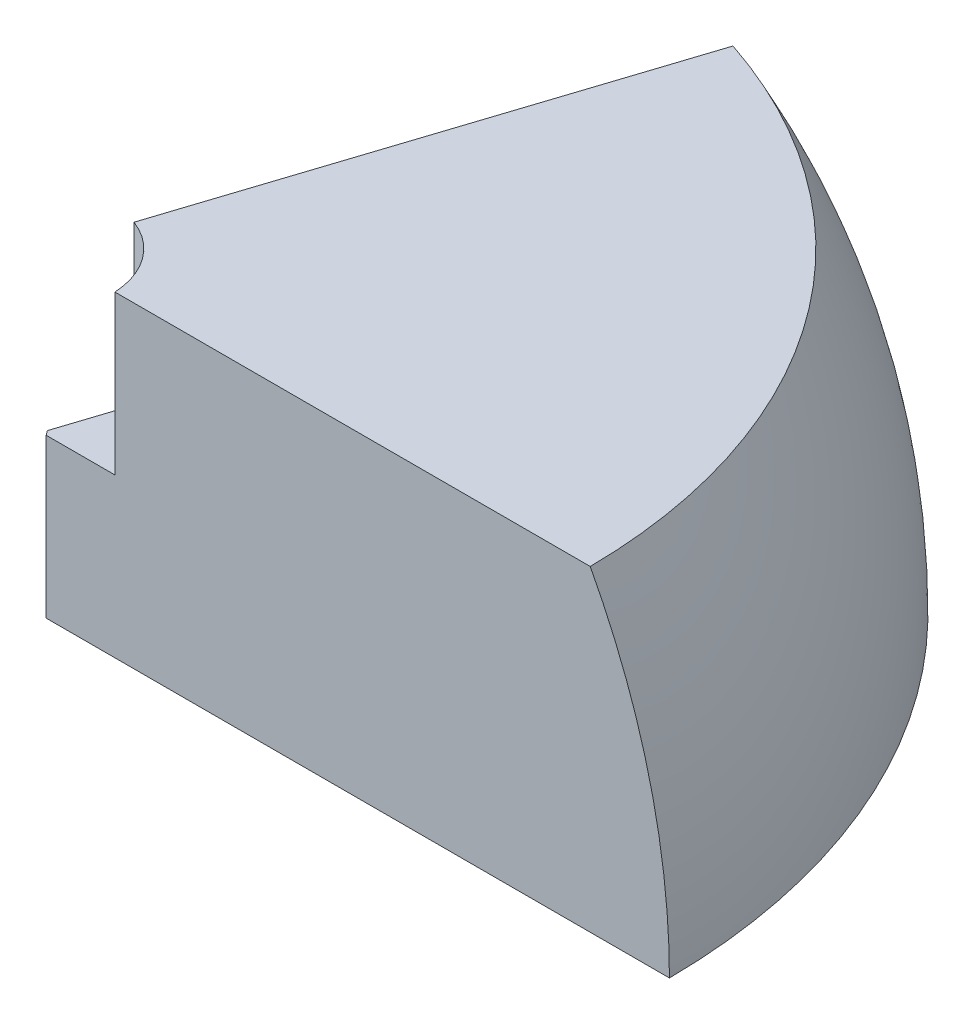
ISO-10303-21;
HEADER;
FILE_DESCRIPTION(('STEP AP214'),'2;1');
FILE_NAME('part.step','',(''),(''),'','','');
FILE_SCHEMA(('AUTOMOTIVE_DESIGN { 1 0 10303 214 1 1 1 1 }'));
ENDSEC;
DATA;
#1=APPLICATION_CONTEXT('core data for automotive mechanical design processes');
#2=APPLICATION_PROTOCOL_DEFINITION('international standard','automotive_design',2000,#1);
#3=PRODUCT_CONTEXT('',#1,'mechanical');
#4=PRODUCT('Part','Part','',(#3));
#5=PRODUCT_RELATED_PRODUCT_CATEGORY('part','',(#4));
#6=PRODUCT_DEFINITION_FORMATION('','',#4);
#7=PRODUCT_DEFINITION_CONTEXT('part definition',#1,'design');
#8=PRODUCT_DEFINITION('design','',#6,#7);
#9=PRODUCT_DEFINITION_SHAPE('','',#8);
#10=(LENGTH_UNIT() NAMED_UNIT(*) SI_UNIT(.MILLI.,.METRE.));
#11=(NAMED_UNIT(*) PLANE_ANGLE_UNIT() SI_UNIT($,.RADIAN.));
#12=(NAMED_UNIT(*) SI_UNIT($,.STERADIAN.) SOLID_ANGLE_UNIT());
#13=UNCERTAINTY_MEASURE_WITH_UNIT(LENGTH_MEASURE(1.E-05),#10,'distance_accuracy_value','');
#14=(GEOMETRIC_REPRESENTATION_CONTEXT(3) GLOBAL_UNCERTAINTY_ASSIGNED_CONTEXT((#13)) GLOBAL_UNIT_ASSIGNED_CONTEXT((#10,
#11,#12)) REPRESENTATION_CONTEXT('',''));
#15=CARTESIAN_POINT('',(0.,0.,0.));
#16=DIRECTION('',(0.,0.,1.));
#17=DIRECTION('',(1.,0.,0.));
#18=AXIS2_PLACEMENT_3D('',#15,#16,#17);
#19=CARTESIAN_POINT('',(0.,0.,0.));
#20=DIRECTION('',(0.,-1.,0.));
#21=DIRECTION('',(0.,0.,-1.));
#22=AXIS2_PLACEMENT_3D('',#19,#20,#21);
#23=PLANE('',#22);
#24=DIRECTION('',(-0.587785252292474,0.,-0.809016994374947));
#25=VECTOR('',#24,1.);
#26=CARTESIAN_POINT('',(1.65890568521156,0.,-0.635));
#27=LINE('',#26,#25);
#28=CARTESIAN_POINT('',(1.65890568521156,0.,-0.635));
#29=VERTEX_POINT('',#28);
#30=CARTESIAN_POINT('',(1.11655093664301,0.,-1.38148727041144));
#31=VERTEX_POINT('',#30);
#32=EDGE_CURVE('E84',#29,#31,#27,.T.);
#33=ORIENTED_EDGE('',*,*,#32,.T.);
#34=DIRECTION('',(-0.309016994374945,0.,0.951056516295154));
#35=VECTOR('',#34,1.);
#36=CARTESIAN_POINT('',(32.0000475163418,0.,-96.4311162641596));
#37=LINE('',#36,#35);
#38=CARTESIAN_POINT('',(31.9994343047552,0.,-96.4292289929545));
#39=VERTEX_POINT('',#38);
#40=EDGE_CURVE('E136',#39,#31,#37,.T.);
#41=ORIENTED_EDGE('',*,*,#40,.F.);
#42=CARTESIAN_POINT('',(0.,0.,0.));
#43=DIRECTION('',(0.,-1.,0.));
#44=DIRECTION('',(0.,0.,-1.));
#45=AXIS2_PLACEMENT_3D('',#42,#43,#44);
#46=CIRCLE('',#45,101.6);
#47=CARTESIAN_POINT('',(101.598015605621,0.,-0.635));
#48=VERTEX_POINT('',#47);
#49=EDGE_CURVE('E104',#39,#48,#46,.T.);
#50=ORIENTED_EDGE('',*,*,#49,.T.);
#51=DIRECTION('',(1.,0.,0.));
#52=VECTOR('',#51,1.);
#53=CARTESIAN_POINT('',(0.667678512391301,0.,-0.635));
#54=LINE('',#53,#52);
#55=EDGE_CURVE('E97',#29,#48,#54,.T.);
#56=ORIENTED_EDGE('',*,*,#55,.F.);
#57=EDGE_LOOP('',(#33,#41,#50,#56));
#58=FACE_BOUND('',#57,.T.);
#59=ADVANCED_FACE('F33',(#58),#23,.T.);
#60=CARTESIAN_POINT('',(0.,50.8,0.));
#61=DIRECTION('',(0.,1.,0.));
#62=DIRECTION('',(0.,0.,1.));
#63=AXIS2_PLACEMENT_3D('',#60,#61,#62);
#64=PLANE('',#63);
#65=CARTESIAN_POINT('',(0.,50.8,0.));
#66=DIRECTION('',(0.,1.,0.));
#67=DIRECTION('',(0.,0.,1.));
#68=AXIS2_PLACEMENT_3D('',#65,#66,#67);
#69=CIRCLE('',#68,12.7);
#70=CARTESIAN_POINT('',(12.6841150657032,50.8,-0.635));
#71=VERTEX_POINT('',#70);
#72=CARTESIAN_POINT('',(4.523528001757,50.8,-11.8670844952465));
#73=VERTEX_POINT('',#72);
#74=EDGE_CURVE('E92',#71,#73,#69,.T.);
#75=ORIENTED_EDGE('',*,*,#74,.F.);
#76=DIRECTION('',(-1.,0.,0.));
#77=VECTOR('',#76,1.);
#78=CARTESIAN_POINT('',(88.9,50.8,-0.635));
#79=LINE('',#78,#77);
#80=CARTESIAN_POINT('',(88.8977321139296,50.8,-0.635));
#81=VERTEX_POINT('',#80);
#82=EDGE_CURVE('E106',#81,#71,#79,.T.);
#83=ORIENTED_EDGE('',*,*,#82,.F.);
#84=CARTESIAN_POINT('',(0.,50.8,0.));
#85=DIRECTION('',(0.,-1.,0.));
#86=DIRECTION('',(0.,0.,-1.));
#87=AXIS2_PLACEMENT_3D('',#84,#85,#86);
#88=CIRCLE('',#87,88.9);
#89=CARTESIAN_POINT('',(28.074830872443,50.8,-84.3505416193857));
#90=VERTEX_POINT('',#89);
#91=EDGE_CURVE('E138',#90,#81,#88,.T.);
#92=ORIENTED_EDGE('',*,*,#91,.F.);
#93=DIRECTION('',(0.309016994374945,0.,-0.951056516295154));
#94=VECTOR('',#93,1.);
#95=CARTESIAN_POINT('',(0.603920887847423,50.8,0.19622579142809));
#96=LINE('',#95,#94);
#97=EDGE_CURVE('E56',#73,#90,#96,.T.);
#98=ORIENTED_EDGE('',*,*,#97,.F.);
#99=EDGE_LOOP('',(#75,#83,#92,#98));
#100=FACE_BOUND('',#99,.T.);
#101=ADVANCED_FACE('F35',(#100),#64,.T.);
#102=CARTESIAN_POINT('',(0.,0.,0.));
#103=DIRECTION('',(0.,-1.,0.));
#104=DIRECTION('',(0.,0.,-1.));
#105=AXIS2_PLACEMENT_3D('',#102,#103,#104);
#106=DEGENERATE_TOROIDAL_SURFACE('',#105,6.35000000000002,107.95,.F.);
#107=ORIENTED_EDGE('',*,*,#91,.T.);
#108=CARTESIAN_POINT('',(95.2711124953083,36.4132104435301,-0.635));
#109=CARTESIAN_POINT('',(95.7810480913048,34.9901052430254,-0.635));
#110=CARTESIAN_POINT('',(96.2610539288999,33.5563653299823,-0.635));
#111=CARTESIAN_POINT('',(97.1603816988496,30.6701476801097,-0.635));
#112=CARTESIAN_POINT('',(97.5797119848334,29.2176725527361,-0.635));
#113=CARTESIAN_POINT('',(98.3570924929354,26.2960768749885,-0.635));
#114=CARTESIAN_POINT('',(98.7151288896013,24.826952648709,-0.635));
#115=CARTESIAN_POINT('',(99.3691924492125,21.8749056563987,-0.635));
#116=CARTESIAN_POINT('',(99.665217351682,20.3919823894152,-0.635));
#117=CARTESIAN_POINT('',(100.194988044725,17.4134893640741,-0.635));
#118=CARTESIAN_POINT('',(100.428669864206,15.9179082279582,-0.635));
#119=CARTESIAN_POINT('',(100.832961619295,12.9181035771953,-0.635));
#120=CARTESIAN_POINT('',(101.003565693849,11.413879272624,-0.635));
#121=CARTESIAN_POINT('',(101.281350844105,8.39979024963739,-0.635));
#122=CARTESIAN_POINT('',(101.388540460905,6.88992631838498,-0.635));
#123=CARTESIAN_POINT('',(101.539350026058,3.86688565023164,-0.635));
#124=CARTESIAN_POINT('',(101.582964026544,2.35370861663209,-0.635));
#125=CARTESIAN_POINT('',(101.606558770675,-0.677327566039614,-0.635));
#126=CARTESIAN_POINT('',(101.586363199197,-2.19518809052004,-0.635));
#127=CARTESIAN_POINT('',(101.481984550683,-5.22884980602679,-0.635));
#128=CARTESIAN_POINT('',(101.397795467588,-6.74465079037862,-0.635));
#129=CARTESIAN_POINT('',(101.165581801395,-9.77123201054434,-0.635));
#130=CARTESIAN_POINT('',(101.017562382343,-11.2820126425565,-0.635));
#131=CARTESIAN_POINT('',(100.65793569996,-14.2961294856534,-0.635));
#132=CARTESIAN_POINT('',(100.446322491211,-15.7994649873254,-0.635));
#133=CARTESIAN_POINT('',(99.9600117756803,-18.7951181939681,-0.635));
#134=CARTESIAN_POINT('',(99.6853462619025,-20.2874410917616,-0.635));
#135=CARTESIAN_POINT('',(99.0733351847728,-23.259316343558,-0.635));
#136=CARTESIAN_POINT('',(98.7359837648581,-24.7388674908064,-0.635));
#137=CARTESIAN_POINT('',(97.9992389774254,-27.6823157969115,-0.635));
#138=CARTESIAN_POINT('',(97.5998516885517,-29.1462144744851,-0.635));
#139=CARTESIAN_POINT('',(96.7397351060913,-32.0559194667724,-0.635));
#140=CARTESIAN_POINT('',(96.2790000748523,-33.5017240753538,-0.635));
#141=CARTESIAN_POINT('',(94.8061140089862,-37.8075415036294,-0.635));
#142=CARTESIAN_POINT('',(93.7030075102157,-40.6370540225822,-0.635));
#143=CARTESIAN_POINT('',(91.2625384569271,-46.1927697409794,-0.635));
#144=CARTESIAN_POINT('',(89.9251749119836,-48.9189725035769,-0.635));
#145=CARTESIAN_POINT('',(87.0247485377654,-54.2507317699608,-0.635));
#146=CARTESIAN_POINT('',(85.461547028407,-56.8562128343954,-0.635));
#147=CARTESIAN_POINT('',(82.1208926428598,-61.9264324326242,-0.635));
#148=CARTESIAN_POINT('',(80.343442032916,-64.3911724547171,-0.635));
#149=CARTESIAN_POINT('',(77.5263262920899,-67.9693836240269,-0.635));
#150=CARTESIAN_POINT('',(76.5617508808297,-69.1427113113557,-0.635));
#151=CARTESIAN_POINT('',(74.5839862987546,-71.4476012530402,-0.635));
#152=CARTESIAN_POINT('',(73.5708016910529,-72.57916741012,-0.635));
#153=CARTESIAN_POINT('',(71.4974733629586,-74.7986711138705,-0.635));
#154=CARTESIAN_POINT('',(70.4373234361299,-75.8866028578698,-0.635));
#155=CARTESIAN_POINT('',(68.2721601181802,-78.0166710469496,-0.635));
#156=CARTESIAN_POINT('',(67.1671509467932,-79.0588117802962,-0.635));
#157=CARTESIAN_POINT('',(64.9157572817051,-81.0940886305243,-0.635));
#158=CARTESIAN_POINT('',(63.7694340949833,-82.0872925695638,-0.635));
#159=CARTESIAN_POINT('',(61.4360701658039,-84.0244330765652,-0.635));
#160=CARTESIAN_POINT('',(60.2490332481997,-84.9683742516249,-0.635));
#161=CARTESIAN_POINT('',(57.8362949708538,-86.8053768319179,-0.635));
#162=CARTESIAN_POINT('',(56.6105951140511,-87.6984402111387,-0.635));
#163=CARTESIAN_POINT('',(54.1227790601296,-89.4320604451128,-0.635));
#164=CARTESIAN_POINT('',(52.8606662755957,-90.2726221970505,-0.635));
#165=CARTESIAN_POINT('',(50.3031677600718,-91.899193721898,-0.635));
#166=CARTESIAN_POINT('',(49.0078091501118,-92.6852461382854,-0.635));
#167=CARTESIAN_POINT('',(46.3852785619727,-94.2020642057936,-0.635));
#168=CARTESIAN_POINT('',(45.0581095647243,-94.9328350108515,-0.635));
#169=CARTESIAN_POINT('',(42.3735162523586,-96.3382300778883,-0.635));
#170=CARTESIAN_POINT('',(41.0160770184917,-97.0128258422355,-0.635));
#171=CARTESIAN_POINT('',(38.2741253771231,-98.3042021911958,-0.635));
#172=CARTESIAN_POINT('',(36.8896155000492,-98.9209881486487,-0.635));
#173=CARTESIAN_POINT('',(34.0909986283621,-100.09776319541,-0.635));
#174=CARTESIAN_POINT('',(32.676805477217,-100.657547389934,-0.635));
#175=CARTESIAN_POINT('',(29.825972244749,-101.716886840299,-0.635));
#176=CARTESIAN_POINT('',(28.3893312964974,-102.216439763495,-0.635));
#177=CARTESIAN_POINT('',(25.4978982323406,-103.153854815058,-0.635));
#178=CARTESIAN_POINT('',(24.0431288381481,-103.591787080174,-0.635));
#179=CARTESIAN_POINT('',(21.1165479943609,-104.40581242485,-0.635));
#180=CARTESIAN_POINT('',(19.6447388618846,-104.781913809061,-0.635));
#181=CARTESIAN_POINT('',(17.4176629879394,-105.301191591873,-0.635));
#182=CARTESIAN_POINT('',(16.6677452932745,-105.467623097343,-0.635));
#183=CARTESIAN_POINT('',(15.1644730336562,-105.78444291174,-0.635));
#184=CARTESIAN_POINT('',(14.4111182784562,-105.934830321086,-0.635));
#185=CARTESIAN_POINT('',(12.9001321452528,-106.219706118537,-0.635));
#186=CARTESIAN_POINT('',(12.1424957944467,-106.354168160178,-0.635));
#187=CARTESIAN_POINT('',(11.0041307079115,-106.543648868288,-0.635));
#188=CARTESIAN_POINT('',(10.624407931838,-106.604766387857,-0.635));
#189=CARTESIAN_POINT('',(9.8643327579162,-106.722929398645,-0.635));
#190=CARTESIAN_POINT('',(9.4839803683634,-106.779974943087,-0.635));
#191=CARTESIAN_POINT('',(8.72511455093272,-106.889633094622,-0.635));
#192=CARTESIAN_POINT('',(8.34660487115873,-106.94227166021,-0.635));
#193=CARTESIAN_POINT('',(7.58902804443973,-107.043508829047,-0.635));
#194=CARTESIAN_POINT('',(7.20996087307146,-107.09210724959,-0.635));
#195=CARTESIAN_POINT('',(6.4509661769718,-107.185288675697,-0.635));
#196=CARTESIAN_POINT('',(6.07103817642884,-107.229867805439,-0.635));
#197=CARTESIAN_POINT('',(5.3107825192674,-107.314926775942,-0.635));
#198=CARTESIAN_POINT('',(4.93045493319235,-107.355407246827,-0.635));
#199=CARTESIAN_POINT('',(4.17051371915155,-107.432104004189,-0.635));
#200=CARTESIAN_POINT('',(3.79090133479747,-107.468332622235,-0.635));
#201=CARTESIAN_POINT('',(3.03109637530381,-107.536578173243,-0.635));
#202=CARTESIAN_POINT('',(2.6509036010168,-107.568592904144,-0.635));
#203=CARTESIAN_POINT('',(2.0807027153626,-107.613021692538,-0.635));
#204=CARTESIAN_POINT('',(1.89083256676984,-107.627220500015,-0.635));
#205=CARTESIAN_POINT('',(1.51094383245497,-107.654234215204,-0.635));
#206=CARTESIAN_POINT('',(1.32092522138637,-107.667048773327,-0.635));
#207=CARTESIAN_POINT('',(1.0359077307807,-107.684689761417,-0.635));
#208=CARTESIAN_POINT('',(0.940957870305254,-107.690303859637,-0.635));
#209=CARTESIAN_POINT('',(0.751008737181622,-107.700756269465,-0.635));
#210=CARTESIAN_POINT('',(0.656009461844932,-107.70559453316,-0.635));
#211=CARTESIAN_POINT('',(0.466005110858172,-107.714005867878,-0.635));
#212=CARTESIAN_POINT('',(0.371000068429669,-107.717579647928,-0.635));
#213=CARTESIAN_POINT('',(0.180941571333524,-107.722504243705,-0.635));
#214=CARTESIAN_POINT('',(0.0858881288259802,-107.723855469288,-0.635));
#215=CARTESIAN_POINT('',(-0.0790275565434309,-107.723713044645,-0.635));
#216=CARTESIAN_POINT('',(-0.148890681471778,-107.722878367771,-0.635));
#217=CARTESIAN_POINT('',(-0.288590671614091,-107.719915546712,-0.635));
#218=CARTESIAN_POINT('',(-0.358427535355616,-107.717787338446,-0.635));
#219=CARTESIAN_POINT('',(-0.49808679700592,-107.712630402693,-0.635));
#220=CARTESIAN_POINT('',(-0.567909184774797,-107.709601413066,-0.635));
#221=CARTESIAN_POINT('',(-0.707523514353697,-107.702939986353,-0.635));
#222=CARTESIAN_POINT('',(-0.777315456571422,-107.699307557614,-0.635));
#223=CARTESIAN_POINT('',(-0.986777225124541,-107.687784782575,-0.635));
#224=CARTESIAN_POINT('',(-1.12641262206727,-107.679274141815,-0.635));
#225=CARTESIAN_POINT('',(-1.40561935127698,-107.661260355357,-0.635));
#226=CARTESIAN_POINT('',(-1.5451906827463,-107.65175719762,-0.635));
#227=CARTESIAN_POINT('',(-1.96433217937079,-107.622070367562,-0.635));
#228=CARTESIAN_POINT('',(-2.24382146432986,-107.600739773189,-0.635));
#229=CARTESIAN_POINT('',(-2.80247882672066,-107.555643041481,-0.635));
#230=CARTESIAN_POINT('',(-3.08164699105767,-107.531877969736,-0.635));
#231=CARTESIAN_POINT('',(-3.64063974905588,-107.481962149893,-0.635));
#232=CARTESIAN_POINT('',(-3.92046370508681,-107.455804255979,-0.635));
#233=CARTESIAN_POINT('',(-4.4799275542163,-107.401231764635,-0.635));
#234=CARTESIAN_POINT('',(-4.75956741903305,-107.37281687757,-0.635));
#235=CARTESIAN_POINT('',(-5.31835277981645,-107.313789393485,-0.635));
#236=CARTESIAN_POINT('',(-5.59749849374343,-107.283178859732,-0.635));
#237=CARTESIAN_POINT('',(-6.15552884304037,-107.219755284528,-0.635));
#238=CARTESIAN_POINT('',(-6.43441348786004,-107.186942326191,-0.635));
#239=CARTESIAN_POINT('',(-6.99334841689856,-107.118949036435,-0.635));
#240=CARTESIAN_POINT('',(-7.27339732771906,-107.083757407485,-0.635));
#241=CARTESIAN_POINT('',(-7.83321119710811,-107.011165601345,-0.635));
#242=CARTESIAN_POINT('',(-8.11297615252065,-106.973765399876,-0.635));
#243=CARTESIAN_POINT('',(-8.95197431815289,-106.858239293169,-0.635));
#244=CARTESIAN_POINT('',(-9.51075602332996,-106.776806721492,-0.635));
#245=CARTESIAN_POINT('',(-10.626018279667,-106.605308576609,-0.635));
#246=CARTESIAN_POINT('',(-11.1825011276176,-106.515257908369,-0.635));
#247=CARTESIAN_POINT('',(-12.293935251149,-106.326445385719,-0.635));
#248=CARTESIAN_POINT('',(-12.8488866622395,-106.227684329318,-0.635));
#249=CARTESIAN_POINT('',(-13.9628721970607,-106.020412215012,-0.635));
#250=CARTESIAN_POINT('',(-14.5218896073234,-105.91181132464,-0.635));
#251=CARTESIAN_POINT('',(-15.6381500097207,-105.68576719089,-0.635));
#252=CARTESIAN_POINT('',(-16.1953929506615,-105.568323694767,-0.635));
#253=CARTESIAN_POINT('',(-17.3082629427019,-105.324559330632,-0.635));
#254=CARTESIAN_POINT('',(-17.8638889120228,-105.198233519811,-0.635));
#255=CARTESIAN_POINT('',(-18.9730599389538,-104.936799009694,-0.635));
#256=CARTESIAN_POINT('',(-19.5266050134239,-104.801690381721,-0.635));
#257=CARTESIAN_POINT('',(-21.1805117717209,-104.384099065932,-0.635));
#258=CARTESIAN_POINT('',(-22.2776179147249,-104.088590022143,-0.635));
#259=CARTESIAN_POINT('',(-24.461736385133,-103.46314349189,-0.635));
#260=CARTESIAN_POINT('',(-25.5487503610629,-103.133211739992,-0.635));
#261=CARTESIAN_POINT('',(-28.0781530072038,-102.321661463824,-0.635));
#262=CARTESIAN_POINT('',(-29.516225517032,-101.826512214921,-0.635));
#263=CARTESIAN_POINT('',(-32.3703120524938,-100.775843541916,-0.635));
#264=CARTESIAN_POINT('',(-33.7863233831154,-100.220316807148,-0.635));
#265=CARTESIAN_POINT('',(-36.5956847396719,-99.0490637232725,-0.635));
#266=CARTESIAN_POINT('',(-37.9889982993998,-98.4332498754794,-0.635));
#267=CARTESIAN_POINT('',(-40.7482667883661,-97.1432403169581,-0.635));
#268=CARTESIAN_POINT('',(-42.1142227292086,-96.4690467698649,-0.635));
#269=CARTESIAN_POINT('',(-44.8078385642776,-95.0679116782015,-0.635));
#270=CARTESIAN_POINT('',(-46.1356860132238,-94.3413306725372,-0.635));
#271=CARTESIAN_POINT('',(-48.759662831583,-92.8329788883094,-0.635));
#272=CARTESIAN_POINT('',(-50.0557920870213,-92.0512079114685,-0.635));
#273=CARTESIAN_POINT('',(-52.6133546193357,-90.4342917413038,-0.635));
#274=CARTESIAN_POINT('',(-53.8748059774077,-89.5991751476811,-0.635));
#275=CARTESIAN_POINT('',(-56.361497639004,-87.876672622764,-0.635));
#276=CARTESIAN_POINT('',(-57.5867380323284,-86.9892868211091,-0.635));
#277=CARTESIAN_POINT('',(-60.001088531229,-85.1621150380033,-0.635));
#278=CARTESIAN_POINT('',(-61.1901272589458,-84.2222347386299,-0.635));
#279=CARTESIAN_POINT('',(-63.5276831743073,-82.2931646651128,-0.635));
#280=CARTESIAN_POINT('',(-64.6761968182615,-81.3039705969166,-0.635));
#281=CARTESIAN_POINT('',(-66.93065132647,-79.2780179262935,-0.635));
#282=CARTESIAN_POINT('',(-68.0365886169275,-78.241255346975,-0.635));
#283=CARTESIAN_POINT('',(-70.20392856739,-76.1219825044588,-0.635));
#284=CARTESIAN_POINT('',(-71.2653270414976,-75.039467960453,-0.635));
#285=CARTESIAN_POINT('',(-73.3439773114585,-72.8281695718081,-0.635));
#286=CARTESIAN_POINT('',(-74.3611223071744,-71.6992853308347,-0.635));
#287=CARTESIAN_POINT('',(-76.346951528331,-69.3994835884348,-0.635));
#288=CARTESIAN_POINT('',(-77.3156311885406,-68.2285621450564,-0.635));
#289=CARTESIAN_POINT('',(-79.2025639144738,-65.8470459139954,-0.635));
#290=CARTESIAN_POINT('',(-80.1208242695117,-64.6364569018306,-0.635));
#291=CARTESIAN_POINT('',(-81.9055167346123,-62.1774872779616,-0.635));
#292=CARTESIAN_POINT('',(-82.7719439846737,-60.9291031389682,-0.635));
#293=CARTESIAN_POINT('',(-84.4506202248773,-58.3979495244185,-0.635));
#294=CARTESIAN_POINT('',(-85.2629145935087,-57.1152101457754,-0.635));
#295=CARTESIAN_POINT('',(-86.8327541823186,-54.5165007500255,-0.635));
#296=CARTESIAN_POINT('',(-87.5902942717656,-53.2005276343131,-0.635));
#297=CARTESIAN_POINT('',(-89.049146228325,-50.5378809162208,-0.635));
#298=CARTESIAN_POINT('',(-89.7504625783452,-49.1912097725166,-0.635));
#299=CARTESIAN_POINT('',(-91.0957075148149,-46.4694607104987,-0.635));
#300=CARTESIAN_POINT('',(-91.7396307311014,-45.0943801487685,-0.635));
#301=CARTESIAN_POINT('',(-93.5823765856159,-40.9327169491878,-0.635));
#302=CARTESIAN_POINT('',(-94.6937775227185,-38.106787678307,-0.635));
#303=CARTESIAN_POINT('',(-96.6745010355705,-32.3717746552756,-0.635));
#304=CARTESIAN_POINT('',(-97.5438247093811,-29.4626912803775,-0.635));
#305=CARTESIAN_POINT('',(-99.0346746809904,-23.5807116280711,-0.635));
#306=CARTESIAN_POINT('',(-99.6561302749468,-20.6077973975274,-0.635));
#307=CARTESIAN_POINT('',(-100.646410233531,-14.620210969533,-0.635));
#308=CARTESIAN_POINT('',(-101.015234170382,-11.6055387013828,-0.635));
#309=CARTESIAN_POINT('',(-101.497707994757,-5.55504048174105,-0.635));
#310=CARTESIAN_POINT('',(-101.611291012634,-2.51920919578751,-0.635));
#311=CARTESIAN_POINT('',(-101.582273581143,3.5512259274791,-0.635));
#312=CARTESIAN_POINT('',(-101.439673194515,6.58582976509257,-0.635));
#313=CARTESIAN_POINT('',(-100.899320099634,12.6320584867744,-0.635));
#314=CARTESIAN_POINT('',(-100.501582150748,15.6436846898714,-0.635));
#315=CARTESIAN_POINT('',(-99.4537954829563,21.6227213951507,-0.635));
#316=CARTESIAN_POINT('',(-98.8037467587013,24.5901318963955,-0.635));
#317=CARTESIAN_POINT('',(-97.2560729544156,30.4592123066665,-0.635));
#318=CARTESIAN_POINT('',(-96.3584837268165,33.3608916700273,-0.635));
#319=CARTESIAN_POINT('',(-94.3220694035656,39.0783261937803,-0.635));
#320=CARTESIAN_POINT('',(-93.1832444478599,41.894081404018,-0.635));
#321=CARTESIAN_POINT('',(-90.6725152845599,47.4195178116755,-0.635));
#322=CARTESIAN_POINT('',(-89.3006225398616,50.1292042177817,-0.635));
#323=CARTESIAN_POINT('',(-86.3334674521961,55.4233941420738,-0.635));
#324=CARTESIAN_POINT('',(-84.738204731383,58.0078974484938,-0.635));
#325=CARTESIAN_POINT('',(-81.3352345309941,63.0339596698516,-0.635));
#326=CARTESIAN_POINT('',(-79.527475344171,65.4754835758538,-0.635));
#327=CARTESIAN_POINT('',(-75.7126898766286,70.197527957486,-0.635));
#328=CARTESIAN_POINT('',(-73.7056647063437,72.4780493302014,-0.635));
#329=CARTESIAN_POINT('',(-69.5064234839253,76.8620820062999,-0.635));
#330=CARTESIAN_POINT('',(-67.3141909435913,78.9655775165005,-0.635));
#331=CARTESIAN_POINT('',(-62.7602315711703,82.9804131765788,-0.635));
#332=CARTESIAN_POINT('',(-60.3985011101379,84.8917492102234,-0.635));
#333=CARTESIAN_POINT('',(-55.5233893427259,88.5078750669119,-0.635));
#334=CARTESIAN_POINT('',(-53.0100707409192,90.212749427062,-0.635));
#335=CARTESIAN_POINT('',(-47.848963388213,93.4046238852645,-0.635));
#336=CARTESIAN_POINT('',(-45.2011851158756,94.8916409261513,-0.635));
#337=CARTESIAN_POINT('',(-39.7893528742326,97.6376162996376,-0.635));
#338=CARTESIAN_POINT('',(-37.0252794388809,98.8965362636087,-0.635));
#339=CARTESIAN_POINT('',(-31.4001027764286,101.177375395366,-0.635));
#340=CARTESIAN_POINT('',(-28.5389736438028,102.199230707592,-0.635));
#341=CARTESIAN_POINT('',(-22.7403241250101,103.998361818582,-0.635));
#342=CARTESIAN_POINT('',(-19.8027872488296,104.775584339492,-0.635));
#343=CARTESIAN_POINT('',(-13.8746373767884,106.079160851853,-0.635));
#344=CARTESIAN_POINT('',(-10.8840740957543,106.605738143516,-0.635));
#345=CARTESIAN_POINT('',(-7.22271718175609,107.091855890683,-0.635));
#346=CARTESIAN_POINT('',(-6.56686894586881,107.172782295863,-0.635));
#347=CARTESIAN_POINT('',(-5.25342837060703,107.322495405252,-0.635));
#348=CARTESIAN_POINT('',(-4.59583534368586,107.391276247473,-0.635));
#349=CARTESIAN_POINT('',(-3.77361105212139,107.469372950466,-0.635));
#350=CARTESIAN_POINT('',(-3.60952056697886,107.484565896573,-0.635));
#351=CARTESIAN_POINT('',(-3.28126650505742,107.514155833571,-0.635));
#352=CARTESIAN_POINT('',(-3.1171029279759,107.528552821135,-0.635));
#353=CARTESIAN_POINT('',(-2.78865518440506,107.556531766669,-0.635));
#354=CARTESIAN_POINT('',(-2.62437099631106,107.570113470681,-0.635));
#355=CARTESIAN_POINT('',(-2.29573807103156,107.59640971173,-0.635));
#356=CARTESIAN_POINT('',(-2.13138933591041,107.609124274538,-0.635));
#357=CARTESIAN_POINT('',(-1.80280367336046,107.633583174219,-0.635));
#358=CARTESIAN_POINT('',(-1.63856682596419,107.645328578475,-0.635));
#359=CARTESIAN_POINT('',(-1.3921390999648,107.662050748506,-0.635));
#360=CARTESIAN_POINT('',(-1.30997860663918,107.6674758362,-0.635));
#361=CARTESIAN_POINT('',(-1.14563442011721,107.677959644019,-0.635));
#362=CARTESIAN_POINT('',(-1.06345072701102,107.683018365548,-0.635));
#363=CARTESIAN_POINT('',(-0.899107669961991,107.692652372783,-0.635));
#364=CARTESIAN_POINT('',(-0.816948324287874,107.697227966857,-0.635));
#365=CARTESIAN_POINT('',(-0.652590097788541,107.705682180429,-0.635));
#366=CARTESIAN_POINT('',(-0.570391215669495,107.709560775306,-0.635));
#367=CARTESIAN_POINT('',(-0.405973378324713,107.716214669494,-0.635));
#368=CARTESIAN_POINT('',(-0.323754438569101,107.718990330907,-0.635));
#369=CARTESIAN_POINT('',(-0.159284161631869,107.722791348222,-0.635));
#370=CARTESIAN_POINT('',(-0.0770328314558403,107.723816975617,-0.635));
#371=CARTESIAN_POINT('',(0.0721820220989059,107.723743143543,-0.635));
#372=CARTESIAN_POINT('',(0.139145855540394,107.723003200317,-0.635));
#373=CARTESIAN_POINT('',(0.273050250760613,107.720313408142,-0.635));
#374=CARTESIAN_POINT('',(0.339990811401812,107.718363506627,-0.635));
#375=CARTESIAN_POINT('',(0.473854165234519,107.713601677355,-0.635));
#376=CARTESIAN_POINT('',(0.540776951559,107.71078956523,-0.635));
#377=CARTESIAN_POINT('',(0.67459386736565,107.704578175509,-0.635));
#378=CARTESIAN_POINT('',(0.741487997157319,107.701178904424,-0.635));
#379=CARTESIAN_POINT('',(0.942231051443194,107.69037103298,-0.635));
#380=CARTESIAN_POINT('',(1.07604702732516,107.682356282468,-0.635));
#381=CARTESIAN_POINT('',(1.34360098289818,107.665367339481,-0.635));
#382=CARTESIAN_POINT('',(1.4773389697511,107.656393256677,-0.635));
#383=CARTESIAN_POINT('',(1.87893559574865,107.628353618548,-0.635));
#384=CARTESIAN_POINT('',(2.14671839395411,107.608197699486,-0.635));
#385=CARTESIAN_POINT('',(2.6820046694034,107.565615336842,-0.635));
#386=CARTESIAN_POINT('',(2.94950821240527,107.543189710817,-0.635));
#387=CARTESIAN_POINT('',(3.48517799654194,107.496127512143,-0.635));
#388=CARTESIAN_POINT('',(3.75334364045511,107.47148413646,-0.635));
#389=CARTESIAN_POINT('',(4.28950410658844,107.420116932604,-0.635));
#390=CARTESIAN_POINT('',(4.55749890761449,107.393392883508,-0.635));
#391=CARTESIAN_POINT('',(5.09304637274021,107.337920110243,-0.635));
#392=CARTESIAN_POINT('',(5.36059921888917,107.309173144771,-0.635));
#393=CARTESIAN_POINT('',(5.89547028396949,107.249652788618,-0.635));
#394=CARTESIAN_POINT('',(6.16278850999656,107.218879461522,-0.635));
#395=CARTESIAN_POINT('',(6.96736867091713,107.123179882824,-0.635));
#396=CARTESIAN_POINT('',(7.50426880919336,107.055183582086,-0.635));
#397=CARTESIAN_POINT('',(8.57712529030082,106.911067667883,-0.635));
#398=CARTESIAN_POINT('',(9.11308133338091,106.834945828232,-0.635));
#399=CARTESIAN_POINT('',(10.1828377734432,106.674767875751,-0.635));
#400=CARTESIAN_POINT('',(10.7166403065421,106.59072603619,-0.635));
#401=CARTESIAN_POINT('',(11.7828735937278,106.414629842695,-0.635));
#402=CARTESIAN_POINT('',(12.3153044643376,106.322576194138,-0.635));
#403=CARTESIAN_POINT('',(13.3848233032019,106.129373148859,-0.635));
#404=CARTESIAN_POINT('',(13.921894611755,106.028131507286,-0.635));
#405=CARTESIAN_POINT('',(14.9944507392931,105.817493556122,-0.635));
#406=CARTESIAN_POINT('',(15.5299355138287,105.708097020261,-0.635));
#407=CARTESIAN_POINT('',(16.5995028470588,105.481110242614,-0.635));
#408=CARTESIAN_POINT('',(17.1335843716174,105.36351512386,-0.635));
#409=CARTESIAN_POINT('',(18.1998885338122,105.120220682532,-0.635));
#410=CARTESIAN_POINT('',(18.7321111860749,104.994521423877,-0.635));
#411=CARTESIAN_POINT('',(20.3221309054303,104.606208670669,-0.635));
#412=CARTESIAN_POINT('',(21.3770246779034,104.331585196092,-0.635));
#413=CARTESIAN_POINT('',(23.4777860586031,103.750572335328,-0.635));
#414=CARTESIAN_POINT('',(24.523655264881,103.444188703621,-0.635));
#415=CARTESIAN_POINT('',(27.0177843677311,102.672339306415,-0.635));
#416=CARTESIAN_POINT('',(28.4614442825482,102.191910643787,-0.635));
#417=CARTESIAN_POINT('',(31.3273318745517,101.170406088448,-0.635));
#418=CARTESIAN_POINT('',(32.7495566220877,100.629321989418,-0.635));
#419=CARTESIAN_POINT('',(35.5723020279834,99.4865338036109,-0.635));
#420=CARTESIAN_POINT('',(36.9727810636422,98.8847268653071,-0.635));
#421=CARTESIAN_POINT('',(39.7469418463874,97.6223805821443,-0.635));
#422=CARTESIAN_POINT('',(41.1206247111055,96.9618436932457,-0.635));
#423=CARTESIAN_POINT('',(43.8286996783364,95.5883200505514,-0.635));
#424=CARTESIAN_POINT('',(45.1633077687955,94.8757591067834,-0.635));
#425=CARTESIAN_POINT('',(47.8014046266445,93.3951768467692,-0.635));
#426=CARTESIAN_POINT('',(49.1048932857842,92.6271553376384,-0.635));
#427=CARTESIAN_POINT('',(51.6776157268936,91.0375228379312,-0.635));
#428=CARTESIAN_POINT('',(52.94687098406,90.215946603223,-0.635));
#429=CARTESIAN_POINT('',(55.4497534296436,88.5202156331443,-0.635));
#430=CARTESIAN_POINT('',(56.6833807224414,87.6460610518377,-0.635));
#431=CARTESIAN_POINT('',(59.1159526283392,85.8444042712333,-0.635));
#432=CARTESIAN_POINT('',(60.3148001093401,84.9167709213696,-0.635));
#433=CARTESIAN_POINT('',(62.6724770691585,83.0117655574317,-0.635));
#434=CARTESIAN_POINT('',(63.8313030214008,82.0343891788289,-0.635));
#435=CARTESIAN_POINT('',(66.1069444204764,80.0315536584015,-0.635));
#436=CARTESIAN_POINT('',(67.2237534380018,79.0060872114729,-0.635));
#437=CARTESIAN_POINT('',(69.4133184663145,76.9089093224357,-0.635));
#438=CARTESIAN_POINT('',(70.4860693931534,75.8371925725135,-0.635));
#439=CARTESIAN_POINT('',(72.587694658218,73.6472159005975,-0.635));
#440=CARTESIAN_POINT('',(73.6164716392086,72.5288625424781,-0.635));
#441=CARTESIAN_POINT('',(75.6257888436446,70.2498617829338,-0.635));
#442=CARTESIAN_POINT('',(76.6063344621858,69.0892191373304,-0.635));
#443=CARTESIAN_POINT('',(78.5174224879803,66.727759393202,-0.635));
#444=CARTESIAN_POINT('',(79.4479730212579,65.5269488752175,-0.635));
#445=CARTESIAN_POINT('',(81.2575051387456,63.0872407934415,-0.635));
#446=CARTESIAN_POINT('',(82.1364885245955,61.8483445625863,-0.635));
#447=CARTESIAN_POINT('',(84.2614920874241,58.7151065997549,-0.635));
#448=CARTESIAN_POINT('',(85.4750240058765,56.7985177039441,-0.635));
#449=CARTESIAN_POINT('',(87.2026594168681,53.8697986714062,-0.635));
#450=CARTESIAN_POINT('',(87.7630663740923,52.8846410466578,-0.635));
#451=CARTESIAN_POINT('',(88.8526701570979,50.8970192960932,-0.635));
#452=CARTESIAN_POINT('',(89.3818625785555,49.8945527536885,-0.635));
#453=CARTESIAN_POINT('',(90.9206754773388,46.8648512399464,-0.635));
#454=CARTESIAN_POINT('',(91.8827589883532,44.8132332946207,-0.635));
#455=CARTESIAN_POINT('',(93.6759975784986,40.6534394843506,-0.635));
#456=CARTESIAN_POINT('',(94.5071437767272,38.5452597944113,-0.635));
#457=CARTESIAN_POINT('',(95.2711124953083,36.4132104435301,-0.635));
#458=B_SPLINE_CURVE_WITH_KNOTS('',3,(#108,#109,#110,#111,#112,#113,#114,#115,#116,#117,#118,
#119,#120,#121,#122,#123,#124,#125,#126,#127,#128,#129,#130,#131,#132,#133,#134,#135,#136,#137,
#138,#139,#140,#141,#142,#143,#144,#145,#146,#147,#148,#149,#150,#151,#152,#153,#154,#155,#156,
#157,#158,#159,#160,#161,#162,#163,#164,#165,#166,#167,#168,#169,#170,#171,#172,#173,#174,#175,
#176,#177,#178,#179,#180,#181,#182,#183,#184,#185,#186,#187,#188,#189,#190,#191,#192,#193,#194,
#195,#196,#197,#198,#199,#200,#201,#202,#203,#204,#205,#206,#207,#208,#209,#210,#211,#212,#213,
#214,#215,#216,#217,#218,#219,#220,#221,#222,#223,#224,#225,#226,#227,#228,#229,#230,#231,#232,
#233,#234,#235,#236,#237,#238,#239,#240,#241,#242,#243,#244,#245,#246,#247,#248,#249,#250,#251,
#252,#253,#254,#255,#256,#257,#258,#259,#260,#261,#262,#263,#264,#265,#266,#267,#268,#269,#270,
#271,#272,#273,#274,#275,#276,#277,#278,#279,#280,#281,#282,#283,#284,#285,#286,#287,#288,#289,
#290,#291,#292,#293,#294,#295,#296,#297,#298,#299,#300,#301,#302,#303,#304,#305,#306,#307,#308,
#309,#310,#311,#312,#313,#314,#315,#316,#317,#318,#319,#320,#321,#322,#323,#324,#325,#326,#327,
#328,#329,#330,#331,#332,#333,#334,#335,#336,#337,#338,#339,#340,#341,#342,#343,#344,#345,#346,
#347,#348,#349,#350,#351,#352,#353,#354,#355,#356,#357,#358,#359,#360,#361,#362,#363,#364,#365,
#366,#367,#368,#369,#370,#371,#372,#373,#374,#375,#376,#377,#378,#379,#380,#381,#382,#383,#384,
#385,#386,#387,#388,#389,#390,#391,#392,#393,#394,#395,#396,#397,#398,#399,#400,#401,#402,#403,
#404,#405,#406,#407,#408,#409,#410,#411,#412,#413,#414,#415,#416,#417,#418,#419,#420,#421,#422,
#423,#424,#425,#426,#427,#428,#429,#430,#431,#432,#433,#434,#435,#436,#437,#438,#439,#440,#441,
#442,#443,#444,#445,#446,#447,#448,#449,#450,#451,#452,#453,#454,#455,#456,#457),.UNSPECIFIED.,
.T.,.F.,(4,2,2,2,2,2,2,2,2,2,2,2,2,2,2,2,2,2,2,2,2,2,2,2,2,2,2,2,2,2,2,2,2,2,2,2,2,2,2,2,2,2,2,
2,2,2,2,2,2,2,2,2,2,2,2,2,2,2,2,2,2,2,2,2,2,2,2,2,2,2,2,2,2,2,2,2,2,2,2,2,2,2,2,2,2,2,2,2,2,2,2,
2,2,2,2,2,2,2,2,2,2,2,2,2,2,2,2,2,2,2,2,2,2,2,2,2,2,2,2,2,2,2,2,2,2,2,2,2,2,2,2,2,2,2,2,2,2,2,2,
2,2,2,2,2,2,2,2,2,2,2,2,2,2,2,2,2,2,2,2,2,2,2,2,2,2,2,2,2,2,2,2,2,2,2,4),(0.,4.5346457163523,
9.06866652094642,13.6037086758376,18.1389161157334,22.6787594497122,27.2190245106044,
31.7586779179742,36.2987560089906,40.8513899554518,45.4044512384853,49.9571442357737,
54.5102629992741,59.0610765777632,63.6123155395633,68.1631088248341,72.7143280301662,
81.8133873963875,90.9124852338345,100.017194483276,109.121807435041,113.677445445155,
118.232656635366,122.788471599962,127.34385900535,131.892744416956,136.441203647553,
140.989486283909,145.537344035418,150.081602826182,154.625437429561,159.1715632556,
163.71726614516,168.278771126394,172.840452709467,177.396899434983,181.95273367257,
184.257080834698,186.561557132198,188.869794154383,190.023605493203,191.177401749011,
192.323837296284,193.470324660396,194.617906020859,195.765310684832,196.909300708918,
198.053886197218,198.625084084928,199.196425891233,199.481771003774,199.767133731451,
200.052336194714,200.337486058469,200.547075082214,200.756674489479,200.966334952866,
201.175992516736,201.595669066282,202.01535070651,202.856241776683,203.696766342155,
204.53988849914,205.38311902758,206.225567292642,207.067983784034,207.914728693388,
208.761482912969,210.455459138451,212.146556835726,213.837499762207,215.545834204438,
217.254217493817,218.963559101157,220.672886829036,224.080881111316,227.488308551147,
232.049669190924,236.611582748889,241.180218342165,245.748684687697,250.288260233718,
254.827852089611,259.365030276354,263.90219721033,268.447796213895,272.993791724378,
277.540167990761,282.086970587201,286.644198179279,291.201854237967,295.758849634239,
300.316271638258,304.869823900885,309.423802300919,313.977417235047,318.531457795687,
327.629565396077,336.727631726828,345.828291408797,354.928966500726,364.032025567857,
373.13508240566,382.237612691247,391.340143169825,400.441355978725,409.542563507832,
418.643323544777,427.744098976479,436.847093522704,445.950037344212,455.053792416608,
464.157742458304,473.257952132147,482.357453703621,491.458484500798,500.561963906033,
509.667424561593,518.764757894594,520.747189262408,522.730574839799,523.224951415011,
523.719330056412,524.213861905052,524.7083790507,525.202344081055,525.449361712539,
525.696378397043,525.943236451582,526.190103224721,526.436888882655,526.683636251807,
526.884526436265,527.085425349114,527.286367250791,527.487306924566,527.889467334492,
528.291581818787,529.097188615181,529.902506254804,530.710384415896,531.518348474205,
532.32561857699,533.132863360413,534.756361824178,536.380306231532,538.00137801438,
539.622307218843,541.261834813008,542.901407915027,544.541964786522,546.182508720127,
549.452116096895,552.721132100288,557.284199891844,561.847885785946,566.419435657942,
570.990794447373,575.528214277633,580.065649889207,584.600169568014,589.134675960515,
593.680819411268,598.227362437524,602.774598356113,607.322357523204,611.879712616103,
616.436556764619,620.9926580051,625.54859997076,632.348808804052,635.748545962724,
639.148761677306,645.941958016654,652.735614910464),.UNSPECIFIED.);
#459=EDGE_CURVE('E105',#81,#48,#458,.T.);
#460=ORIENTED_EDGE('',*,*,#459,.T.);
#461=ORIENTED_EDGE('',*,*,#49,.F.);
#462=CARTESIAN_POINT('',(31.9994343046979,-0.00019999999998678,-96.4292289927783));
#463=CARTESIAN_POINT('',(31.9994417586177,1.53244638510875,-96.4292519335844));
#464=CARTESIAN_POINT('',(31.989349741781,3.06509146527585,-96.3981918995093));
#465=CARTESIAN_POINT('',(31.9490137204242,6.12761869883829,-96.2740503906243));
#466=CARTESIAN_POINT('',(31.9187695014563,7.65750082265817,-96.1809682558122));
#467=CARTESIAN_POINT('',(31.838161048792,10.7122768812055,-95.9328809480902));
#468=CARTESIAN_POINT('',(31.7877893384578,12.2371687497806,-95.777852764455));
#469=CARTESIAN_POINT('',(31.6670201370774,15.2786048555945,-95.4061633815688));
#470=CARTESIAN_POINT('',(31.5966229368096,16.7951492137166,-95.1895030772416));
#471=CARTESIAN_POINT('',(31.4375506555762,19.786678844504,-94.6999289360683));
#472=CARTESIAN_POINT('',(31.349272790096,21.2618854724897,-94.4282376027831));
#473=CARTESIAN_POINT('',(31.1537671297582,24.1990889057013,-93.8265330505367));
#474=CARTESIAN_POINT('',(31.0465393803117,25.6610857425739,-93.4965199713368));
#475=CARTESIAN_POINT('',(30.8133721170771,28.5686834317406,-92.7789049238717));
#476=CARTESIAN_POINT('',(30.6874408086877,30.0142911762188,-92.3913282092268));
#477=CARTESIAN_POINT('',(30.4170632479685,32.8871119455903,-91.5591916417795));
#478=CARTESIAN_POINT('',(30.2726188383068,34.3143267856499,-91.1146374601269));
#479=CARTESIAN_POINT('',(29.9792651313207,37.0206399795264,-90.2117875855664));
#480=CARTESIAN_POINT('',(29.8319239980915,38.3015214879205,-89.7583182054781));
#481=CARTESIAN_POINT('',(29.5223509559072,40.8440055331829,-88.805550349994));
#482=CARTESIAN_POINT('',(29.3601220870842,42.1056119449921,-88.3062612311629));
#483=CARTESIAN_POINT('',(29.0193944806147,44.6196932875759,-87.2576094860708));
#484=CARTESIAN_POINT('',(28.8407577101563,45.8719723187068,-86.7078220384966));
#485=CARTESIAN_POINT('',(28.4687537882867,48.3537217174616,-85.5629116923941));
#486=CARTESIAN_POINT('',(28.2753836249346,49.5831873571279,-84.9677795240644));
#487=CARTESIAN_POINT('',(28.074797909706,50.8002,-84.3504401705128));
#488=B_SPLINE_CURVE_WITH_KNOTS('',3,(#462,#463,#464,#465,#466,#467,#468,#469,#470,#471,#472,
#473,#474,#475,#476,#477,#478,#479,#480,#481,#482,#483,#484,#485,#486,#487),.UNSPECIFIED.,.F.,
.F.,(4,2,2,2,2,2,2,2,2,2,2,2,4),(0.,4.59758936218161,9.19522764995548,13.7945753847617,
18.3938563385684,22.9003891757953,27.406911213789,31.9114620131942,36.4155648079202,
40.5148420711944,44.6132841012701,48.7500750510301,52.8877139639548),.UNSPECIFIED.);
#489=EDGE_CURVE('E131',#39,#90,#488,.T.);
#490=ORIENTED_EDGE('',*,*,#489,.T.);
#491=EDGE_LOOP('',(#107,#460,#461,#490));
#492=FACE_BOUND('',#491,.T.);
#493=ADVANCED_FACE('F118',(#492),#106,.F.);
#494=CARTESIAN_POINT('',(-1.35833702643348,0.,6.23543466990234));
#495=DIRECTION('',(-0.951056516295154,0.,-0.309016994374945));
#496=DIRECTION('',(-0.309016994374945,0.,0.951056516295154));
#497=AXIS2_PLACEMENT_3D('',#494,#495,#496);
#498=PLANE('',#497);
#499=DIRECTION('',(0.,1.,0.));
#500=VECTOR('',#499,1.);
#501=CARTESIAN_POINT('',(1.11655093664301,-0.001000000000001,-1.38148727041144));
#502=LINE('',#501,#500);
#503=CARTESIAN_POINT('',(1.11655093664301,25.4,-1.38148727041144));
#504=VERTEX_POINT('',#503);
#505=EDGE_CURVE('E87',#31,#504,#502,.T.);
#506=ORIENTED_EDGE('',*,*,#505,.T.);
#507=DIRECTION('',(0.309016994374945,0.,-0.951056516295154));
#508=VECTOR('',#507,1.);
#509=CARTESIAN_POINT('',(-1.35833702643348,25.4,6.23543466990234));
#510=LINE('',#509,#508);
#511=CARTESIAN_POINT('',(4.523528001757,25.4,-11.8670844952465));
#512=VERTEX_POINT('',#511);
#513=EDGE_CURVE('E152',#504,#512,#510,.T.);
#514=ORIENTED_EDGE('',*,*,#513,.T.);
#515=DIRECTION('',(0.,1.,0.));
#516=VECTOR('',#515,1.);
#517=CARTESIAN_POINT('',(4.523528001757,25.4,-11.8670844952465));
#518=LINE('',#517,#516);
#519=EDGE_CURVE('E110',#73,#512,#518,.F.);
#520=ORIENTED_EDGE('',*,*,#519,.F.);
#521=ORIENTED_EDGE('',*,*,#97,.T.);
#522=ORIENTED_EDGE('',*,*,#489,.F.);
#523=ORIENTED_EDGE('',*,*,#40,.T.);
#524=EDGE_LOOP('',(#506,#514,#520,#521,#522,#523));
#525=FACE_BOUND('',#524,.T.);
#526=ADVANCED_FACE('F126',(#525),#498,.T.);
#527=CARTESIAN_POINT('',(-6.35000000000002,0.,-0.635));
#528=DIRECTION('',(0.,0.,1.));
#529=DIRECTION('',(1.,0.,0.));
#530=AXIS2_PLACEMENT_3D('',#527,#528,#529);
#531=PLANE('',#530);
#532=DIRECTION('',(0.,1.,0.));
#533=VECTOR('',#532,1.);
#534=CARTESIAN_POINT('',(1.65890568521156,-0.001000000000001,-0.635));
#535=LINE('',#534,#533);
#536=CARTESIAN_POINT('',(1.65890568521156,25.4,-0.635));
#537=VERTEX_POINT('',#536);
#538=EDGE_CURVE('E48',#29,#537,#535,.T.);
#539=ORIENTED_EDGE('',*,*,#538,.F.);
#540=ORIENTED_EDGE('',*,*,#55,.T.);
#541=ORIENTED_EDGE('',*,*,#459,.F.);
#542=ORIENTED_EDGE('',*,*,#82,.T.);
#543=DIRECTION('',(0.,1.,0.));
#544=VECTOR('',#543,1.);
#545=CARTESIAN_POINT('',(12.6841150657032,25.4,-0.635));
#546=LINE('',#545,#544);
#547=CARTESIAN_POINT('',(12.6841150657032,25.4,-0.635));
#548=VERTEX_POINT('',#547);
#549=EDGE_CURVE('E11',#548,#71,#546,.T.);
#550=ORIENTED_EDGE('',*,*,#549,.F.);
#551=DIRECTION('',(-1.,0.,0.));
#552=VECTOR('',#551,1.);
#553=CARTESIAN_POINT('',(-6.35000000000002,25.4,-0.635));
#554=LINE('',#553,#552);
#555=EDGE_CURVE('E41',#548,#537,#554,.T.);
#556=ORIENTED_EDGE('',*,*,#555,.T.);
#557=EDGE_LOOP('',(#539,#540,#541,#542,#550,#556));
#558=FACE_BOUND('',#557,.T.);
#559=ADVANCED_FACE('F96',(#558),#531,.T.);
#560=CARTESIAN_POINT('',(0.,25.4,0.));
#561=DIRECTION('',(0.,1.,0.));
#562=DIRECTION('',(0.,0.,1.));
#563=AXIS2_PLACEMENT_3D('',#560,#561,#562);
#564=CYLINDRICAL_SURFACE('',#563,12.7);
#565=ORIENTED_EDGE('',*,*,#519,.T.);
#566=CARTESIAN_POINT('',(0.,25.4,0.));
#567=DIRECTION('',(0.,1.,0.));
#568=DIRECTION('',(0.,0.,1.));
#569=AXIS2_PLACEMENT_3D('',#566,#567,#568);
#570=CIRCLE('',#569,12.7);
#571=EDGE_CURVE('E149',#548,#512,#570,.T.);
#572=ORIENTED_EDGE('',*,*,#571,.F.);
#573=ORIENTED_EDGE('',*,*,#549,.T.);
#574=ORIENTED_EDGE('',*,*,#74,.T.);
#575=EDGE_LOOP('',(#565,#572,#573,#574));
#576=FACE_BOUND('',#575,.T.);
#577=ADVANCED_FACE('F125',(#576),#564,.F.);
#578=CARTESIAN_POINT('',(0.,25.4,0.));
#579=DIRECTION('',(0.,1.,0.));
#580=DIRECTION('',(0.,0.,1.));
#581=AXIS2_PLACEMENT_3D('',#578,#579,#580);
#582=PLANE('',#581);
#583=DIRECTION('',(-0.587785252292474,0.,-0.809016994374947));
#584=VECTOR('',#583,1.);
#585=CARTESIAN_POINT('',(1.65890568521156,25.4,-0.635));
#586=LINE('',#585,#584);
#587=EDGE_CURVE('E100',#537,#504,#586,.T.);
#588=ORIENTED_EDGE('',*,*,#587,.F.);
#589=ORIENTED_EDGE('',*,*,#555,.F.);
#590=ORIENTED_EDGE('',*,*,#571,.T.);
#591=ORIENTED_EDGE('',*,*,#513,.F.);
#592=EDGE_LOOP('',(#588,#589,#590,#591));
#593=FACE_BOUND('',#592,.T.);
#594=ADVANCED_FACE('F158',(#593),#582,.T.);
#595=CARTESIAN_POINT('',(1.65890568521156,-0.001000000000001,-0.635));
#596=DIRECTION('',(0.809016994374947,0.,-0.587785252292474));
#597=DIRECTION('',(-0.587785252292474,0.,-0.809016994374947));
#598=AXIS2_PLACEMENT_3D('',#595,#596,#597);
#599=PLANE('',#598);
#600=ORIENTED_EDGE('',*,*,#538,.T.);
#601=ORIENTED_EDGE('',*,*,#587,.T.);
#602=ORIENTED_EDGE('',*,*,#505,.F.);
#603=ORIENTED_EDGE('',*,*,#32,.F.);
#604=EDGE_LOOP('',(#600,#601,#602,#603));
#605=FACE_BOUND('',#604,.T.);
#606=ADVANCED_FACE('F85',(#605),#599,.F.);
#607=CLOSED_SHELL('',(#59,#101,#493,#526,#559,#577,#594,#606));
#608=MANIFOLD_SOLID_BREP('B2',#607);
#609=ADVANCED_BREP_SHAPE_REPRESENTATION('',(#18,#608),#14);
#610=SHAPE_DEFINITION_REPRESENTATION(#9,#609);
ENDSEC;
END-ISO-10303-21;
